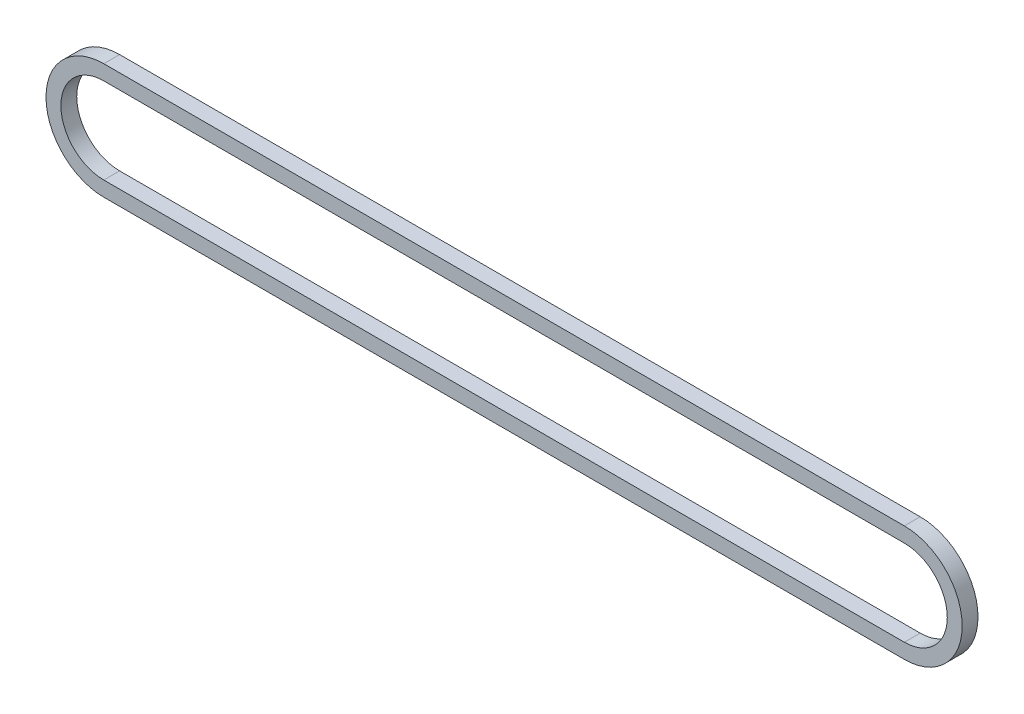
ISO-10303-21;
HEADER;
FILE_DESCRIPTION(('STEP AP214'),'2;1');
FILE_NAME('part.step','',(''),(''),'','','');
FILE_SCHEMA(('AUTOMOTIVE_DESIGN { 1 0 10303 214 1 1 1 1 }'));
ENDSEC;
DATA;
#1=APPLICATION_CONTEXT('core data for automotive mechanical design processes');
#2=APPLICATION_PROTOCOL_DEFINITION('international standard','automotive_design',2000,#1);
#3=PRODUCT_CONTEXT('',#1,'mechanical');
#4=PRODUCT('Part','Part','',(#3));
#5=PRODUCT_RELATED_PRODUCT_CATEGORY('part','',(#4));
#6=PRODUCT_DEFINITION_FORMATION('','',#4);
#7=PRODUCT_DEFINITION_CONTEXT('part definition',#1,'design');
#8=PRODUCT_DEFINITION('design','',#6,#7);
#9=PRODUCT_DEFINITION_SHAPE('','',#8);
#10=(LENGTH_UNIT() NAMED_UNIT(*) SI_UNIT(.MILLI.,.METRE.));
#11=(NAMED_UNIT(*) PLANE_ANGLE_UNIT() SI_UNIT($,.RADIAN.));
#12=(NAMED_UNIT(*) SI_UNIT($,.STERADIAN.) SOLID_ANGLE_UNIT());
#13=UNCERTAINTY_MEASURE_WITH_UNIT(LENGTH_MEASURE(1.E-05),#10,'distance_accuracy_value','');
#14=(GEOMETRIC_REPRESENTATION_CONTEXT(3) GLOBAL_UNCERTAINTY_ASSIGNED_CONTEXT((#13)) GLOBAL_UNIT_ASSIGNED_CONTEXT((#10,
#11,#12)) REPRESENTATION_CONTEXT('',''));
#15=CARTESIAN_POINT('',(0.,0.,0.));
#16=DIRECTION('',(0.,0.,1.));
#17=DIRECTION('',(1.,0.,0.));
#18=AXIS2_PLACEMENT_3D('',#15,#16,#17);
#19=CARTESIAN_POINT('',(-161.275,0.,3.19));
#20=DIRECTION('',(0.,0.,1.));
#21=DIRECTION('',(1.,0.,0.));
#22=AXIS2_PLACEMENT_3D('',#19,#20,#21);
#23=PLANE('',#22);
#24=CARTESIAN_POINT('',(-161.275,0.,3.19));
#25=DIRECTION('',(0.,0.,1.));
#26=DIRECTION('',(1.,0.,0.));
#27=AXIS2_PLACEMENT_3D('',#24,#25,#26);
#28=CIRCLE('',#27,23.295);
#29=CARTESIAN_POINT('',(-161.275,23.295,3.19));
#30=VERTEX_POINT('',#29);
#31=CARTESIAN_POINT('',(-161.275,-23.295,3.19));
#32=VERTEX_POINT('',#31);
#33=EDGE_CURVE('E136',#30,#32,#28,.T.);
#34=ORIENTED_EDGE('',*,*,#33,.T.);
#35=DIRECTION('',(1.,0.,0.));
#36=VECTOR('',#35,1.);
#37=CARTESIAN_POINT('',(-161.275,-23.295,3.19));
#38=LINE('',#37,#36);
#39=CARTESIAN_POINT('',(161.275,-23.295,3.19));
#40=VERTEX_POINT('',#39);
#41=EDGE_CURVE('E139',#32,#40,#38,.T.);
#42=ORIENTED_EDGE('',*,*,#41,.T.);
#43=CARTESIAN_POINT('',(161.275,0.,3.19));
#44=DIRECTION('',(0.,0.,1.));
#45=DIRECTION('',(1.,0.,0.));
#46=AXIS2_PLACEMENT_3D('',#43,#44,#45);
#47=CIRCLE('',#46,23.295);
#48=CARTESIAN_POINT('',(161.275,23.2950000000001,3.19));
#49=VERTEX_POINT('',#48);
#50=EDGE_CURVE('E142',#40,#49,#47,.T.);
#51=ORIENTED_EDGE('',*,*,#50,.T.);
#52=DIRECTION('',(-1.,0.,0.));
#53=VECTOR('',#52,1.);
#54=CARTESIAN_POINT('',(-161.275,23.295,3.19));
#55=LINE('',#54,#53);
#56=EDGE_CURVE('E144',#49,#30,#55,.T.);
#57=ORIENTED_EDGE('',*,*,#56,.T.);
#58=EDGE_LOOP('',(#34,#42,#51,#57));
#59=FACE_BOUND('',#58,.T.);
#60=DIRECTION('',(1.,0.,0.));
#61=VECTOR('',#60,1.);
#62=CARTESIAN_POINT('',(-161.275,-17.295,3.19));
#63=LINE('',#62,#61);
#64=CARTESIAN_POINT('',(-161.275,-17.295,3.19));
#65=VERTEX_POINT('',#64);
#66=CARTESIAN_POINT('',(161.275,-17.2949999999999,3.19));
#67=VERTEX_POINT('',#66);
#68=EDGE_CURVE('E108',#65,#67,#63,.T.);
#69=ORIENTED_EDGE('',*,*,#68,.F.);
#70=CARTESIAN_POINT('',(-161.275,0.,3.19));
#71=DIRECTION('',(0.,0.,1.));
#72=DIRECTION('',(1.,0.,0.));
#73=AXIS2_PLACEMENT_3D('',#70,#71,#72);
#74=CIRCLE('',#73,17.295);
#75=CARTESIAN_POINT('',(-161.275,17.295,3.19));
#76=VERTEX_POINT('',#75);
#77=EDGE_CURVE('E100',#76,#65,#74,.T.);
#78=ORIENTED_EDGE('',*,*,#77,.F.);
#79=DIRECTION('',(-1.,0.,0.));
#80=VECTOR('',#79,1.);
#81=CARTESIAN_POINT('',(-161.275,17.295,3.19));
#82=LINE('',#81,#80);
#83=CARTESIAN_POINT('',(161.275,17.2950000000001,3.19));
#84=VERTEX_POINT('',#83);
#85=EDGE_CURVE('E122',#84,#76,#82,.T.);
#86=ORIENTED_EDGE('',*,*,#85,.F.);
#87=CARTESIAN_POINT('',(161.275,0.,3.19));
#88=DIRECTION('',(0.,0.,1.));
#89=DIRECTION('',(1.,0.,0.));
#90=AXIS2_PLACEMENT_3D('',#87,#88,#89);
#91=CIRCLE('',#90,17.295);
#92=EDGE_CURVE('E120',#67,#84,#91,.T.);
#93=ORIENTED_EDGE('',*,*,#92,.F.);
#94=EDGE_LOOP('',(#69,#78,#86,#93));
#95=FACE_BOUND('',#94,.T.);
#96=ADVANCED_FACE('F35',(#59,#95),#23,.T.);
#97=CARTESIAN_POINT('',(-161.275,0.,-3.19));
#98=DIRECTION('',(0.,0.,1.));
#99=DIRECTION('',(1.,0.,0.));
#100=AXIS2_PLACEMENT_3D('',#97,#98,#99);
#101=PLANE('',#100);
#102=CARTESIAN_POINT('',(-161.275,0.,-3.19));
#103=DIRECTION('',(0.,0.,1.));
#104=DIRECTION('',(1.,0.,0.));
#105=AXIS2_PLACEMENT_3D('',#102,#103,#104);
#106=CIRCLE('',#105,23.295);
#107=CARTESIAN_POINT('',(-161.275,23.295,-3.19));
#108=VERTEX_POINT('',#107);
#109=CARTESIAN_POINT('',(-161.275,-23.295,-3.19));
#110=VERTEX_POINT('',#109);
#111=EDGE_CURVE('E116',#108,#110,#106,.T.);
#112=ORIENTED_EDGE('',*,*,#111,.F.);
#113=DIRECTION('',(-1.,0.,0.));
#114=VECTOR('',#113,1.);
#115=CARTESIAN_POINT('',(-161.275,23.295,-3.19));
#116=LINE('',#115,#114);
#117=CARTESIAN_POINT('',(161.275,23.2950000000001,-3.19));
#118=VERTEX_POINT('',#117);
#119=EDGE_CURVE('E140',#118,#108,#116,.T.);
#120=ORIENTED_EDGE('',*,*,#119,.F.);
#121=CARTESIAN_POINT('',(161.275,0.,-3.19));
#122=DIRECTION('',(0.,0.,1.));
#123=DIRECTION('',(1.,0.,0.));
#124=AXIS2_PLACEMENT_3D('',#121,#122,#123);
#125=CIRCLE('',#124,23.295);
#126=CARTESIAN_POINT('',(161.275,-23.295,-3.19));
#127=VERTEX_POINT('',#126);
#128=EDGE_CURVE('E151',#127,#118,#125,.T.);
#129=ORIENTED_EDGE('',*,*,#128,.F.);
#130=DIRECTION('',(1.,0.,0.));
#131=VECTOR('',#130,1.);
#132=CARTESIAN_POINT('',(-161.275,-23.295,-3.19));
#133=LINE('',#132,#131);
#134=EDGE_CURVE('E149',#110,#127,#133,.T.);
#135=ORIENTED_EDGE('',*,*,#134,.F.);
#136=EDGE_LOOP('',(#112,#120,#129,#135));
#137=FACE_BOUND('',#136,.T.);
#138=CARTESIAN_POINT('',(-161.275,0.,-3.19));
#139=DIRECTION('',(0.,0.,1.));
#140=DIRECTION('',(1.,0.,0.));
#141=AXIS2_PLACEMENT_3D('',#138,#139,#140);
#142=CIRCLE('',#141,17.295);
#143=CARTESIAN_POINT('',(-161.275,17.295,-3.19));
#144=VERTEX_POINT('',#143);
#145=CARTESIAN_POINT('',(-161.275,-17.295,-3.19));
#146=VERTEX_POINT('',#145);
#147=EDGE_CURVE('E58',#144,#146,#142,.T.);
#148=ORIENTED_EDGE('',*,*,#147,.T.);
#149=DIRECTION('',(1.,0.,0.));
#150=VECTOR('',#149,1.);
#151=CARTESIAN_POINT('',(-161.275,-17.295,-3.19));
#152=LINE('',#151,#150);
#153=CARTESIAN_POINT('',(161.275,-17.2949999999999,-3.19));
#154=VERTEX_POINT('',#153);
#155=EDGE_CURVE('E115',#146,#154,#152,.T.);
#156=ORIENTED_EDGE('',*,*,#155,.T.);
#157=CARTESIAN_POINT('',(161.275,0.,-3.19));
#158=DIRECTION('',(0.,0.,1.));
#159=DIRECTION('',(1.,0.,0.));
#160=AXIS2_PLACEMENT_3D('',#157,#158,#159);
#161=CIRCLE('',#160,17.295);
#162=CARTESIAN_POINT('',(161.275,17.2950000000001,-3.19));
#163=VERTEX_POINT('',#162);
#164=EDGE_CURVE('E128',#154,#163,#161,.T.);
#165=ORIENTED_EDGE('',*,*,#164,.T.);
#166=DIRECTION('',(-1.,0.,0.));
#167=VECTOR('',#166,1.);
#168=CARTESIAN_POINT('',(-161.275,17.295,-3.19));
#169=LINE('',#168,#167);
#170=EDGE_CURVE('E109',#163,#144,#169,.T.);
#171=ORIENTED_EDGE('',*,*,#170,.T.);
#172=EDGE_LOOP('',(#148,#156,#165,#171));
#173=FACE_BOUND('',#172,.T.);
#174=ADVANCED_FACE('F169',(#137,#173),#101,.F.);
#175=CARTESIAN_POINT('',(-161.275,0.,3.19));
#176=DIRECTION('',(0.,0.,-1.));
#177=DIRECTION('',(-1.,0.,0.));
#178=AXIS2_PLACEMENT_3D('',#175,#176,#177);
#179=CYLINDRICAL_SURFACE('',#178,23.295);
#180=ORIENTED_EDGE('',*,*,#111,.T.);
#181=DIRECTION('',(0.,0.,-1.));
#182=VECTOR('',#181,1.);
#183=CARTESIAN_POINT('',(-161.275,-23.295,3.19));
#184=LINE('',#183,#182);
#185=EDGE_CURVE('E11',#32,#110,#184,.T.);
#186=ORIENTED_EDGE('',*,*,#185,.F.);
#187=ORIENTED_EDGE('',*,*,#33,.F.);
#188=DIRECTION('',(0.,0.,-1.));
#189=VECTOR('',#188,1.);
#190=CARTESIAN_POINT('',(-161.275,23.295,3.19));
#191=LINE('',#190,#189);
#192=EDGE_CURVE('E146',#30,#108,#191,.T.);
#193=ORIENTED_EDGE('',*,*,#192,.T.);
#194=EDGE_LOOP('',(#180,#186,#187,#193));
#195=FACE_BOUND('',#194,.T.);
#196=ADVANCED_FACE('F37',(#195),#179,.T.);
#197=CARTESIAN_POINT('',(-161.275,-23.295,3.19));
#198=DIRECTION('',(0.,1.,0.));
#199=DIRECTION('',(-1.,0.,0.));
#200=AXIS2_PLACEMENT_3D('',#197,#198,#199);
#201=PLANE('',#200);
#202=ORIENTED_EDGE('',*,*,#134,.T.);
#203=DIRECTION('',(0.,0.,-1.));
#204=VECTOR('',#203,1.);
#205=CARTESIAN_POINT('',(161.275,-23.295,3.19));
#206=LINE('',#205,#204);
#207=EDGE_CURVE('E43',#40,#127,#206,.T.);
#208=ORIENTED_EDGE('',*,*,#207,.F.);
#209=ORIENTED_EDGE('',*,*,#41,.F.);
#210=ORIENTED_EDGE('',*,*,#185,.T.);
#211=EDGE_LOOP('',(#202,#208,#209,#210));
#212=FACE_BOUND('',#211,.T.);
#213=ADVANCED_FACE('F179',(#212),#201,.F.);
#214=CARTESIAN_POINT('',(161.275,0.,3.19));
#215=DIRECTION('',(0.,0.,-1.));
#216=DIRECTION('',(-1.,0.,0.));
#217=AXIS2_PLACEMENT_3D('',#214,#215,#216);
#218=CYLINDRICAL_SURFACE('',#217,23.295);
#219=ORIENTED_EDGE('',*,*,#128,.T.);
#220=DIRECTION('',(0.,0.,-1.));
#221=VECTOR('',#220,1.);
#222=CARTESIAN_POINT('',(161.275,23.2950000000001,3.19));
#223=LINE('',#222,#221);
#224=EDGE_CURVE('E156',#49,#118,#223,.T.);
#225=ORIENTED_EDGE('',*,*,#224,.F.);
#226=ORIENTED_EDGE('',*,*,#50,.F.);
#227=ORIENTED_EDGE('',*,*,#207,.T.);
#228=EDGE_LOOP('',(#219,#225,#226,#227));
#229=FACE_BOUND('',#228,.T.);
#230=ADVANCED_FACE('F163',(#229),#218,.T.);
#231=CARTESIAN_POINT('',(-161.275,23.295,3.19));
#232=DIRECTION('',(0.,-1.,0.));
#233=DIRECTION('',(1.,0.,0.));
#234=AXIS2_PLACEMENT_3D('',#231,#232,#233);
#235=PLANE('',#234);
#236=ORIENTED_EDGE('',*,*,#119,.T.);
#237=ORIENTED_EDGE('',*,*,#192,.F.);
#238=ORIENTED_EDGE('',*,*,#56,.F.);
#239=ORIENTED_EDGE('',*,*,#224,.T.);
#240=EDGE_LOOP('',(#236,#237,#238,#239));
#241=FACE_BOUND('',#240,.T.);
#242=ADVANCED_FACE('F173',(#241),#235,.F.);
#243=CARTESIAN_POINT('',(-161.275,0.,3.19));
#244=DIRECTION('',(0.,0.,-1.));
#245=DIRECTION('',(-1.,0.,0.));
#246=AXIS2_PLACEMENT_3D('',#243,#244,#245);
#247=CYLINDRICAL_SURFACE('',#246,17.295);
#248=ORIENTED_EDGE('',*,*,#147,.F.);
#249=DIRECTION('',(0.,0.,-1.));
#250=VECTOR('',#249,1.);
#251=CARTESIAN_POINT('',(-161.275,17.295,3.19));
#252=LINE('',#251,#250);
#253=EDGE_CURVE('E104',#76,#144,#252,.T.);
#254=ORIENTED_EDGE('',*,*,#253,.F.);
#255=ORIENTED_EDGE('',*,*,#77,.T.);
#256=DIRECTION('',(0.,0.,-1.));
#257=VECTOR('',#256,1.);
#258=CARTESIAN_POINT('',(-161.275,-17.295,3.19));
#259=LINE('',#258,#257);
#260=EDGE_CURVE('E103',#65,#146,#259,.T.);
#261=ORIENTED_EDGE('',*,*,#260,.T.);
#262=EDGE_LOOP('',(#248,#254,#255,#261));
#263=FACE_BOUND('',#262,.T.);
#264=ADVANCED_FACE('F102',(#263),#247,.F.);
#265=CARTESIAN_POINT('',(-161.275,-17.295,3.19));
#266=DIRECTION('',(0.,1.,0.));
#267=DIRECTION('',(-1.,0.,0.));
#268=AXIS2_PLACEMENT_3D('',#265,#266,#267);
#269=PLANE('',#268);
#270=ORIENTED_EDGE('',*,*,#155,.F.);
#271=ORIENTED_EDGE('',*,*,#260,.F.);
#272=ORIENTED_EDGE('',*,*,#68,.T.);
#273=DIRECTION('',(0.,0.,-1.));
#274=VECTOR('',#273,1.);
#275=CARTESIAN_POINT('',(161.275,-17.2949999999999,3.19));
#276=LINE('',#275,#274);
#277=EDGE_CURVE('E117',#67,#154,#276,.T.);
#278=ORIENTED_EDGE('',*,*,#277,.T.);
#279=EDGE_LOOP('',(#270,#271,#272,#278));
#280=FACE_BOUND('',#279,.T.);
#281=ADVANCED_FACE('F112',(#280),#269,.T.);
#282=CARTESIAN_POINT('',(161.275,0.,3.19));
#283=DIRECTION('',(0.,0.,-1.));
#284=DIRECTION('',(-1.,0.,0.));
#285=AXIS2_PLACEMENT_3D('',#282,#283,#284);
#286=CYLINDRICAL_SURFACE('',#285,17.295);
#287=ORIENTED_EDGE('',*,*,#164,.F.);
#288=ORIENTED_EDGE('',*,*,#277,.F.);
#289=ORIENTED_EDGE('',*,*,#92,.T.);
#290=DIRECTION('',(0.,0.,-1.));
#291=VECTOR('',#290,1.);
#292=CARTESIAN_POINT('',(161.275,17.2950000000001,3.19));
#293=LINE('',#292,#291);
#294=EDGE_CURVE('E50',#84,#163,#293,.T.);
#295=ORIENTED_EDGE('',*,*,#294,.T.);
#296=EDGE_LOOP('',(#287,#288,#289,#295));
#297=FACE_BOUND('',#296,.T.);
#298=ADVANCED_FACE('F202',(#297),#286,.F.);
#299=CARTESIAN_POINT('',(-161.275,17.295,3.19));
#300=DIRECTION('',(0.,-1.,0.));
#301=DIRECTION('',(1.,0.,0.));
#302=AXIS2_PLACEMENT_3D('',#299,#300,#301);
#303=PLANE('',#302);
#304=ORIENTED_EDGE('',*,*,#170,.F.);
#305=ORIENTED_EDGE('',*,*,#294,.F.);
#306=ORIENTED_EDGE('',*,*,#85,.T.);
#307=ORIENTED_EDGE('',*,*,#253,.T.);
#308=EDGE_LOOP('',(#304,#305,#306,#307));
#309=FACE_BOUND('',#308,.T.);
#310=ADVANCED_FACE('F206',(#309),#303,.T.);
#311=CLOSED_SHELL('',(#96,#174,#196,#213,#230,#242,#264,#281,#298,#310));
#312=MANIFOLD_SOLID_BREP('B2',#311);
#313=ADVANCED_BREP_SHAPE_REPRESENTATION('',(#18,#312),#14);
#314=SHAPE_DEFINITION_REPRESENTATION(#9,#313);
ENDSEC;
END-ISO-10303-21;
